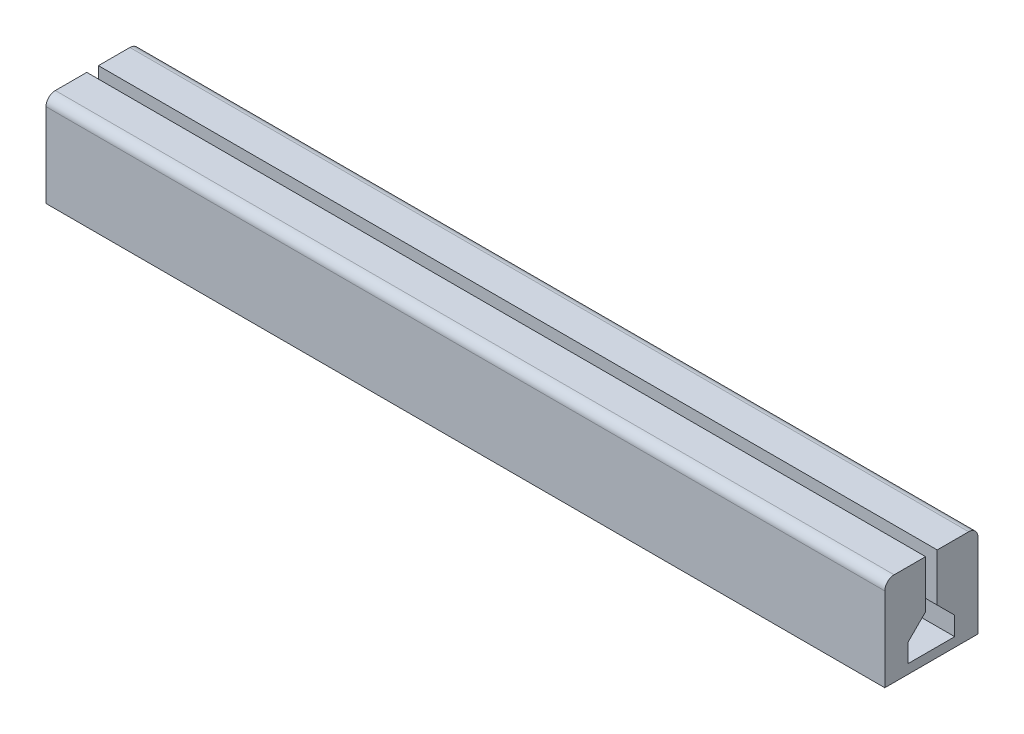
ISO-10303-21;
HEADER;
FILE_DESCRIPTION(('STEP AP214'),'2;1');
FILE_NAME('part.step','',(''),(''),'','','');
FILE_SCHEMA(('AUTOMOTIVE_DESIGN { 1 0 10303 214 1 1 1 1 }'));
ENDSEC;
DATA;
#1=APPLICATION_CONTEXT('core data for automotive mechanical design processes');
#2=APPLICATION_PROTOCOL_DEFINITION('international standard','automotive_design',2000,#1);
#3=PRODUCT_CONTEXT('',#1,'mechanical');
#4=PRODUCT('Part','Part','',(#3));
#5=PRODUCT_RELATED_PRODUCT_CATEGORY('part','',(#4));
#6=PRODUCT_DEFINITION_FORMATION('','',#4);
#7=PRODUCT_DEFINITION_CONTEXT('part definition',#1,'design');
#8=PRODUCT_DEFINITION('design','',#6,#7);
#9=PRODUCT_DEFINITION_SHAPE('','',#8);
#10=(LENGTH_UNIT() NAMED_UNIT(*) SI_UNIT(.MILLI.,.METRE.));
#11=(NAMED_UNIT(*) PLANE_ANGLE_UNIT() SI_UNIT($,.RADIAN.));
#12=(NAMED_UNIT(*) SI_UNIT($,.STERADIAN.) SOLID_ANGLE_UNIT());
#13=UNCERTAINTY_MEASURE_WITH_UNIT(LENGTH_MEASURE(1.E-05),#10,'distance_accuracy_value','');
#14=(GEOMETRIC_REPRESENTATION_CONTEXT(3) GLOBAL_UNCERTAINTY_ASSIGNED_CONTEXT((#13)) GLOBAL_UNIT_ASSIGNED_CONTEXT((#10,
#11,#12)) REPRESENTATION_CONTEXT('',''));
#15=CARTESIAN_POINT('',(0.,0.,0.));
#16=DIRECTION('',(0.,0.,1.));
#17=DIRECTION('',(1.,0.,0.));
#18=AXIS2_PLACEMENT_3D('',#15,#16,#17);
#19=CARTESIAN_POINT('',(114.3,22.86,-10.16));
#20=DIRECTION('',(-1.,0.,0.));
#21=DIRECTION('',(0.,0.,1.));
#22=AXIS2_PLACEMENT_3D('',#19,#20,#21);
#23=CYLINDRICAL_SURFACE('',#22,2.54);
#24=CARTESIAN_POINT('',(-114.3,22.86,-10.16));
#25=DIRECTION('',(1.,0.,0.));
#26=DIRECTION('',(0.,0.,-1.));
#27=AXIS2_PLACEMENT_3D('',#24,#25,#26);
#28=CIRCLE('',#27,2.54);
#29=CARTESIAN_POINT('',(-114.3,25.4,-10.16));
#30=VERTEX_POINT('',#29);
#31=CARTESIAN_POINT('',(-114.3,22.86,-12.7));
#32=VERTEX_POINT('',#31);
#33=EDGE_CURVE('E169',#30,#32,#28,.F.);
#34=ORIENTED_EDGE('',*,*,#33,.F.);
#35=DIRECTION('',(-1.,0.,0.));
#36=VECTOR('',#35,1.);
#37=CARTESIAN_POINT('',(114.3,25.4,-10.16));
#38=LINE('',#37,#36);
#39=CARTESIAN_POINT('',(114.3,25.4,-10.16));
#40=VERTEX_POINT('',#39);
#41=EDGE_CURVE('E11',#40,#30,#38,.T.);
#42=ORIENTED_EDGE('',*,*,#41,.F.);
#43=CARTESIAN_POINT('',(114.3,22.86,-10.16));
#44=DIRECTION('',(1.,0.,0.));
#45=DIRECTION('',(0.,0.,-1.));
#46=AXIS2_PLACEMENT_3D('',#43,#44,#45);
#47=CIRCLE('',#46,2.54);
#48=CARTESIAN_POINT('',(114.3,22.86,-12.7));
#49=VERTEX_POINT('',#48);
#50=EDGE_CURVE('E213',#40,#49,#47,.F.);
#51=ORIENTED_EDGE('',*,*,#50,.T.);
#52=DIRECTION('',(-1.,0.,0.));
#53=VECTOR('',#52,1.);
#54=CARTESIAN_POINT('',(114.3,22.86,-12.7));
#55=LINE('',#54,#53);
#56=EDGE_CURVE('E109',#49,#32,#55,.T.);
#57=ORIENTED_EDGE('',*,*,#56,.T.);
#58=EDGE_LOOP('',(#34,#42,#51,#57));
#59=FACE_BOUND('',#58,.T.);
#60=ADVANCED_FACE('F43',(#59),#23,.T.);
#61=CARTESIAN_POINT('',(114.3,25.4,0.));
#62=DIRECTION('',(0.,-1.,0.));
#63=DIRECTION('',(0.,0.,-1.));
#64=AXIS2_PLACEMENT_3D('',#61,#62,#63);
#65=PLANE('',#64);
#66=DIRECTION('',(0.,0.,1.));
#67=VECTOR('',#66,1.);
#68=CARTESIAN_POINT('',(-114.3,25.4,0.));
#69=LINE('',#68,#67);
#70=CARTESIAN_POINT('',(-114.3,25.4,-1.5875));
#71=VERTEX_POINT('',#70);
#72=EDGE_CURVE('E173',#30,#71,#69,.T.);
#73=ORIENTED_EDGE('',*,*,#72,.T.);
#74=DIRECTION('',(-1.,0.,0.));
#75=VECTOR('',#74,1.);
#76=CARTESIAN_POINT('',(114.3,25.4,-1.5875));
#77=LINE('',#76,#75);
#78=CARTESIAN_POINT('',(114.3,25.4,-1.5875));
#79=VERTEX_POINT('',#78);
#80=EDGE_CURVE('E51',#79,#71,#77,.T.);
#81=ORIENTED_EDGE('',*,*,#80,.F.);
#82=DIRECTION('',(0.,0.,1.));
#83=VECTOR('',#82,1.);
#84=CARTESIAN_POINT('',(114.3,25.4,0.));
#85=LINE('',#84,#83);
#86=EDGE_CURVE('E268',#40,#79,#85,.T.);
#87=ORIENTED_EDGE('',*,*,#86,.F.);
#88=ORIENTED_EDGE('',*,*,#41,.T.);
#89=EDGE_LOOP('',(#73,#81,#87,#88));
#90=FACE_BOUND('',#89,.T.);
#91=ADVANCED_FACE('F300',(#90),#65,.F.);
#92=CARTESIAN_POINT('',(114.3,0.,-1.5875));
#93=DIRECTION('',(0.,0.,-1.));
#94=DIRECTION('',(0.,1.,0.));
#95=AXIS2_PLACEMENT_3D('',#92,#93,#94);
#96=PLANE('',#95);
#97=DIRECTION('',(0.,-1.,0.));
#98=VECTOR('',#97,1.);
#99=CARTESIAN_POINT('',(-114.3,0.,-1.5875));
#100=LINE('',#99,#98);
#101=CARTESIAN_POINT('',(-114.3,12.3824999999999,-1.5875));
#102=VERTEX_POINT('',#101);
#103=EDGE_CURVE('E177',#71,#102,#100,.T.);
#104=ORIENTED_EDGE('',*,*,#103,.T.);
#105=DIRECTION('',(1.,0.,0.));
#106=VECTOR('',#105,1.);
#107=CARTESIAN_POINT('',(-114.3,12.3824999999999,-1.5875));
#108=LINE('',#107,#106);
#109=CARTESIAN_POINT('',(114.3,12.3824999999999,-1.5875));
#110=VERTEX_POINT('',#109);
#111=EDGE_CURVE('E58',#102,#110,#108,.T.);
#112=ORIENTED_EDGE('',*,*,#111,.T.);
#113=DIRECTION('',(0.,-1.,0.));
#114=VECTOR('',#113,1.);
#115=CARTESIAN_POINT('',(114.3,0.,-1.5875));
#116=LINE('',#115,#114);
#117=EDGE_CURVE('E246',#79,#110,#116,.T.);
#118=ORIENTED_EDGE('',*,*,#117,.F.);
#119=ORIENTED_EDGE('',*,*,#80,.T.);
#120=EDGE_LOOP('',(#104,#112,#118,#119));
#121=FACE_BOUND('',#120,.T.);
#122=ADVANCED_FACE('F244',(#121),#96,.F.);
#123=CARTESIAN_POINT('',(114.3,0.,-6.35));
#124=DIRECTION('',(0.,0.,-1.));
#125=DIRECTION('',(0.,1.,0.));
#126=AXIS2_PLACEMENT_3D('',#123,#124,#125);
#127=PLANE('',#126);
#128=DIRECTION('',(0.,-1.,0.));
#129=VECTOR('',#128,1.);
#130=CARTESIAN_POINT('',(-114.3,0.,-6.35));
#131=LINE('',#130,#129);
#132=CARTESIAN_POINT('',(-114.3,7.62,-6.35));
#133=VERTEX_POINT('',#132);
#134=CARTESIAN_POINT('',(-114.3,2.54,-6.35));
#135=VERTEX_POINT('',#134);
#136=EDGE_CURVE('E181',#133,#135,#131,.T.);
#137=ORIENTED_EDGE('',*,*,#136,.T.);
#138=DIRECTION('',(-1.,0.,0.));
#139=VECTOR('',#138,1.);
#140=CARTESIAN_POINT('',(114.3,2.54,-6.35));
#141=LINE('',#140,#139);
#142=CARTESIAN_POINT('',(114.3,2.54,-6.35));
#143=VERTEX_POINT('',#142);
#144=EDGE_CURVE('E232',#143,#135,#141,.T.);
#145=ORIENTED_EDGE('',*,*,#144,.F.);
#146=DIRECTION('',(0.,-1.,0.));
#147=VECTOR('',#146,1.);
#148=CARTESIAN_POINT('',(114.3,0.,-6.35));
#149=LINE('',#148,#147);
#150=CARTESIAN_POINT('',(114.3,7.62,-6.35));
#151=VERTEX_POINT('',#150);
#152=EDGE_CURVE('E273',#151,#143,#149,.T.);
#153=ORIENTED_EDGE('',*,*,#152,.F.);
#154=DIRECTION('',(-1.,0.,0.));
#155=VECTOR('',#154,1.);
#156=CARTESIAN_POINT('',(114.3,7.62,-6.35));
#157=LINE('',#156,#155);
#158=EDGE_CURVE('E235',#151,#133,#157,.T.);
#159=ORIENTED_EDGE('',*,*,#158,.T.);
#160=EDGE_LOOP('',(#137,#145,#153,#159));
#161=FACE_BOUND('',#160,.T.);
#162=ADVANCED_FACE('F306',(#161),#127,.F.);
#163=CARTESIAN_POINT('',(114.3,2.54,0.));
#164=DIRECTION('',(0.,1.,0.));
#165=DIRECTION('',(0.,0.,1.));
#166=AXIS2_PLACEMENT_3D('',#163,#164,#165);
#167=PLANE('',#166);
#168=DIRECTION('',(0.,0.,-1.));
#169=VECTOR('',#168,1.);
#170=CARTESIAN_POINT('',(-114.3,2.54,0.));
#171=LINE('',#170,#169);
#172=CARTESIAN_POINT('',(-114.3,2.54,6.35));
#173=VERTEX_POINT('',#172);
#174=EDGE_CURVE('E185',#173,#135,#171,.T.);
#175=ORIENTED_EDGE('',*,*,#174,.F.);
#176=DIRECTION('',(-1.,0.,0.));
#177=VECTOR('',#176,1.);
#178=CARTESIAN_POINT('',(114.3,2.54,6.35));
#179=LINE('',#178,#177);
#180=CARTESIAN_POINT('',(114.3,2.54,6.35));
#181=VERTEX_POINT('',#180);
#182=EDGE_CURVE('E229',#181,#173,#179,.T.);
#183=ORIENTED_EDGE('',*,*,#182,.F.);
#184=DIRECTION('',(0.,0.,-1.));
#185=VECTOR('',#184,1.);
#186=CARTESIAN_POINT('',(114.3,2.54,0.));
#187=LINE('',#186,#185);
#188=EDGE_CURVE('E276',#181,#143,#187,.T.);
#189=ORIENTED_EDGE('',*,*,#188,.T.);
#190=ORIENTED_EDGE('',*,*,#144,.T.);
#191=EDGE_LOOP('',(#175,#183,#189,#190));
#192=FACE_BOUND('',#191,.T.);
#193=ADVANCED_FACE('F311',(#192),#167,.T.);
#194=CARTESIAN_POINT('',(114.3,0.,6.35));
#195=DIRECTION('',(0.,0.,-1.));
#196=DIRECTION('',(-1.,0.,0.));
#197=AXIS2_PLACEMENT_3D('',#194,#195,#196);
#198=PLANE('',#197);
#199=DIRECTION('',(0.,-1.,0.));
#200=VECTOR('',#199,1.);
#201=CARTESIAN_POINT('',(-114.3,0.,6.35));
#202=LINE('',#201,#200);
#203=CARTESIAN_POINT('',(-114.3,7.62,6.35));
#204=VERTEX_POINT('',#203);
#205=EDGE_CURVE('E189',#204,#173,#202,.T.);
#206=ORIENTED_EDGE('',*,*,#205,.F.);
#207=DIRECTION('',(-1.,0.,0.));
#208=VECTOR('',#207,1.);
#209=CARTESIAN_POINT('',(114.3,7.62,6.35));
#210=LINE('',#209,#208);
#211=CARTESIAN_POINT('',(114.3,7.62,6.35));
#212=VERTEX_POINT('',#211);
#213=EDGE_CURVE('E226',#212,#204,#210,.T.);
#214=ORIENTED_EDGE('',*,*,#213,.F.);
#215=DIRECTION('',(0.,-1.,0.));
#216=VECTOR('',#215,1.);
#217=CARTESIAN_POINT('',(114.3,0.,6.35));
#218=LINE('',#217,#216);
#219=EDGE_CURVE('E280',#212,#181,#218,.T.);
#220=ORIENTED_EDGE('',*,*,#219,.T.);
#221=ORIENTED_EDGE('',*,*,#182,.T.);
#222=EDGE_LOOP('',(#206,#214,#220,#221));
#223=FACE_BOUND('',#222,.T.);
#224=ADVANCED_FACE('F315',(#223),#198,.T.);
#225=CARTESIAN_POINT('',(114.3,0.,1.5875));
#226=DIRECTION('',(0.,0.,-1.));
#227=DIRECTION('',(0.,1.,0.));
#228=AXIS2_PLACEMENT_3D('',#225,#226,#227);
#229=PLANE('',#228);
#230=DIRECTION('',(1.,0.,0.));
#231=VECTOR('',#230,1.);
#232=CARTESIAN_POINT('',(-114.3,12.3824999999999,1.5875));
#233=LINE('',#232,#231);
#234=CARTESIAN_POINT('',(-114.3,12.3824999999999,1.5875));
#235=VERTEX_POINT('',#234);
#236=CARTESIAN_POINT('',(114.3,12.3824999999999,1.5875));
#237=VERTEX_POINT('',#236);
#238=EDGE_CURVE('E174',#235,#237,#233,.T.);
#239=ORIENTED_EDGE('',*,*,#238,.F.);
#240=DIRECTION('',(0.,-1.,0.));
#241=VECTOR('',#240,1.);
#242=CARTESIAN_POINT('',(-114.3,0.,1.5875));
#243=LINE('',#242,#241);
#244=CARTESIAN_POINT('',(-114.3,25.4,1.5875));
#245=VERTEX_POINT('',#244);
#246=EDGE_CURVE('E193',#245,#235,#243,.T.);
#247=ORIENTED_EDGE('',*,*,#246,.F.);
#248=DIRECTION('',(-1.,0.,0.));
#249=VECTOR('',#248,1.);
#250=CARTESIAN_POINT('',(114.3,25.4,1.5875));
#251=LINE('',#250,#249);
#252=CARTESIAN_POINT('',(114.3,25.4,1.5875));
#253=VERTEX_POINT('',#252);
#254=EDGE_CURVE('E223',#253,#245,#251,.T.);
#255=ORIENTED_EDGE('',*,*,#254,.F.);
#256=DIRECTION('',(0.,-1.,0.));
#257=VECTOR('',#256,1.);
#258=CARTESIAN_POINT('',(114.3,0.,1.5875));
#259=LINE('',#258,#257);
#260=EDGE_CURVE('E284',#253,#237,#259,.T.);
#261=ORIENTED_EDGE('',*,*,#260,.T.);
#262=EDGE_LOOP('',(#239,#247,#255,#261));
#263=FACE_BOUND('',#262,.T.);
#264=ADVANCED_FACE('F319',(#263),#229,.T.);
#265=CARTESIAN_POINT('',(114.3,25.4,0.));
#266=DIRECTION('',(0.,1.,0.));
#267=DIRECTION('',(0.,0.,1.));
#268=AXIS2_PLACEMENT_3D('',#265,#266,#267);
#269=PLANE('',#268);
#270=DIRECTION('',(0.,0.,-1.));
#271=VECTOR('',#270,1.);
#272=CARTESIAN_POINT('',(-114.3,25.4,0.));
#273=LINE('',#272,#271);
#274=CARTESIAN_POINT('',(-114.3,25.4,10.16));
#275=VERTEX_POINT('',#274);
#276=EDGE_CURVE('E197',#275,#245,#273,.T.);
#277=ORIENTED_EDGE('',*,*,#276,.F.);
#278=DIRECTION('',(-1.,0.,0.));
#279=VECTOR('',#278,1.);
#280=CARTESIAN_POINT('',(114.3,25.4,10.16));
#281=LINE('',#280,#279);
#282=CARTESIAN_POINT('',(114.3,25.4,10.16));
#283=VERTEX_POINT('',#282);
#284=EDGE_CURVE('E220',#283,#275,#281,.T.);
#285=ORIENTED_EDGE('',*,*,#284,.F.);
#286=DIRECTION('',(0.,0.,-1.));
#287=VECTOR('',#286,1.);
#288=CARTESIAN_POINT('',(114.3,25.4,0.));
#289=LINE('',#288,#287);
#290=EDGE_CURVE('E288',#283,#253,#289,.T.);
#291=ORIENTED_EDGE('',*,*,#290,.T.);
#292=ORIENTED_EDGE('',*,*,#254,.T.);
#293=EDGE_LOOP('',(#277,#285,#291,#292));
#294=FACE_BOUND('',#293,.T.);
#295=ADVANCED_FACE('F323',(#294),#269,.T.);
#296=CARTESIAN_POINT('',(114.3,22.86,10.16));
#297=DIRECTION('',(-1.,0.,0.));
#298=DIRECTION('',(0.,0.,1.));
#299=AXIS2_PLACEMENT_3D('',#296,#297,#298);
#300=CYLINDRICAL_SURFACE('',#299,2.54);
#301=CARTESIAN_POINT('',(-114.3,22.86,10.16));
#302=DIRECTION('',(1.,0.,0.));
#303=DIRECTION('',(0.,0.,-1.));
#304=AXIS2_PLACEMENT_3D('',#301,#302,#303);
#305=CIRCLE('',#304,2.54);
#306=CARTESIAN_POINT('',(-114.3,22.86,12.7));
#307=VERTEX_POINT('',#306);
#308=EDGE_CURVE('E201',#307,#275,#305,.F.);
#309=ORIENTED_EDGE('',*,*,#308,.F.);
#310=DIRECTION('',(-1.,0.,0.));
#311=VECTOR('',#310,1.);
#312=CARTESIAN_POINT('',(114.3,22.86,12.7));
#313=LINE('',#312,#311);
#314=CARTESIAN_POINT('',(114.3,22.86,12.7));
#315=VERTEX_POINT('',#314);
#316=EDGE_CURVE('E150',#315,#307,#313,.T.);
#317=ORIENTED_EDGE('',*,*,#316,.F.);
#318=CARTESIAN_POINT('',(114.3,22.86,10.16));
#319=DIRECTION('',(1.,0.,0.));
#320=DIRECTION('',(0.,0.,-1.));
#321=AXIS2_PLACEMENT_3D('',#318,#319,#320);
#322=CIRCLE('',#321,2.54);
#323=EDGE_CURVE('E159',#315,#283,#322,.F.);
#324=ORIENTED_EDGE('',*,*,#323,.T.);
#325=ORIENTED_EDGE('',*,*,#284,.T.);
#326=EDGE_LOOP('',(#309,#317,#324,#325));
#327=FACE_BOUND('',#326,.T.);
#328=ADVANCED_FACE('F294',(#327),#300,.T.);
#329=CARTESIAN_POINT('',(114.3,0.,12.7));
#330=DIRECTION('',(0.,0.,1.));
#331=DIRECTION('',(1.,0.,0.));
#332=AXIS2_PLACEMENT_3D('',#329,#330,#331);
#333=PLANE('',#332);
#334=DIRECTION('',(0.,1.,0.));
#335=VECTOR('',#334,1.);
#336=CARTESIAN_POINT('',(-114.3,0.,12.7));
#337=LINE('',#336,#335);
#338=CARTESIAN_POINT('',(-114.3,0.,12.7));
#339=VERTEX_POINT('',#338);
#340=EDGE_CURVE('E144',#339,#307,#337,.T.);
#341=ORIENTED_EDGE('',*,*,#340,.F.);
#342=DIRECTION('',(-1.,0.,0.));
#343=VECTOR('',#342,1.);
#344=CARTESIAN_POINT('',(114.3,0.,12.7));
#345=LINE('',#344,#343);
#346=CARTESIAN_POINT('',(114.3,0.,12.7));
#347=VERTEX_POINT('',#346);
#348=EDGE_CURVE('E139',#347,#339,#345,.T.);
#349=ORIENTED_EDGE('',*,*,#348,.F.);
#350=DIRECTION('',(0.,1.,0.));
#351=VECTOR('',#350,1.);
#352=CARTESIAN_POINT('',(114.3,0.,12.7));
#353=LINE('',#352,#351);
#354=EDGE_CURVE('E142',#347,#315,#353,.T.);
#355=ORIENTED_EDGE('',*,*,#354,.T.);
#356=ORIENTED_EDGE('',*,*,#316,.T.);
#357=EDGE_LOOP('',(#341,#349,#355,#356));
#358=FACE_BOUND('',#357,.T.);
#359=ADVANCED_FACE('F141',(#358),#333,.T.);
#360=CARTESIAN_POINT('',(114.3,0.,0.));
#361=DIRECTION('',(0.,-1.,0.));
#362=DIRECTION('',(0.,0.,-1.));
#363=AXIS2_PLACEMENT_3D('',#360,#361,#362);
#364=PLANE('',#363);
#365=DIRECTION('',(0.,0.,1.));
#366=VECTOR('',#365,1.);
#367=CARTESIAN_POINT('',(-114.3,0.,0.));
#368=LINE('',#367,#366);
#369=CARTESIAN_POINT('',(-114.3,0.,-12.7));
#370=VERTEX_POINT('',#369);
#371=EDGE_CURVE('E207',#370,#339,#368,.T.);
#372=ORIENTED_EDGE('',*,*,#371,.F.);
#373=DIRECTION('',(-1.,0.,0.));
#374=VECTOR('',#373,1.);
#375=CARTESIAN_POINT('',(114.3,0.,-12.7));
#376=LINE('',#375,#374);
#377=CARTESIAN_POINT('',(114.3,0.,-12.7));
#378=VERTEX_POINT('',#377);
#379=EDGE_CURVE('E151',#378,#370,#376,.T.);
#380=ORIENTED_EDGE('',*,*,#379,.F.);
#381=DIRECTION('',(0.,0.,1.));
#382=VECTOR('',#381,1.);
#383=CARTESIAN_POINT('',(114.3,0.,0.));
#384=LINE('',#383,#382);
#385=EDGE_CURVE('E156',#378,#347,#384,.T.);
#386=ORIENTED_EDGE('',*,*,#385,.T.);
#387=ORIENTED_EDGE('',*,*,#348,.T.);
#388=EDGE_LOOP('',(#372,#380,#386,#387));
#389=FACE_BOUND('',#388,.T.);
#390=ADVANCED_FACE('F162',(#389),#364,.T.);
#391=CARTESIAN_POINT('',(114.3,0.,-12.7));
#392=DIRECTION('',(0.,0.,1.));
#393=DIRECTION('',(0.,-1.,0.));
#394=AXIS2_PLACEMENT_3D('',#391,#392,#393);
#395=PLANE('',#394);
#396=DIRECTION('',(0.,1.,0.));
#397=VECTOR('',#396,1.);
#398=CARTESIAN_POINT('',(-114.3,0.,-12.7));
#399=LINE('',#398,#397);
#400=EDGE_CURVE('E210',#370,#32,#399,.T.);
#401=ORIENTED_EDGE('',*,*,#400,.T.);
#402=ORIENTED_EDGE('',*,*,#56,.F.);
#403=DIRECTION('',(0.,1.,0.));
#404=VECTOR('',#403,1.);
#405=CARTESIAN_POINT('',(114.3,0.,-12.7));
#406=LINE('',#405,#404);
#407=EDGE_CURVE('E67',#378,#49,#406,.T.);
#408=ORIENTED_EDGE('',*,*,#407,.F.);
#409=ORIENTED_EDGE('',*,*,#379,.T.);
#410=EDGE_LOOP('',(#401,#402,#408,#409));
#411=FACE_BOUND('',#410,.T.);
#412=ADVANCED_FACE('F298',(#411),#395,.F.);
#413=CARTESIAN_POINT('',(114.3,0.,0.));
#414=DIRECTION('',(1.,0.,0.));
#415=DIRECTION('',(0.,0.,-1.));
#416=AXIS2_PLACEMENT_3D('',#413,#414,#415);
#417=PLANE('',#416);
#418=DIRECTION('',(0.,-0.707106781186544,0.707106781186551));
#419=VECTOR('',#418,1.);
#420=CARTESIAN_POINT('',(114.3,7.62,6.35));
#421=LINE('',#420,#419);
#422=EDGE_CURVE('E260',#237,#212,#421,.T.);
#423=ORIENTED_EDGE('',*,*,#422,.F.);
#424=ORIENTED_EDGE('',*,*,#260,.F.);
#425=ORIENTED_EDGE('',*,*,#290,.F.);
#426=ORIENTED_EDGE('',*,*,#323,.F.);
#427=ORIENTED_EDGE('',*,*,#354,.F.);
#428=ORIENTED_EDGE('',*,*,#385,.F.);
#429=ORIENTED_EDGE('',*,*,#407,.T.);
#430=ORIENTED_EDGE('',*,*,#50,.F.);
#431=ORIENTED_EDGE('',*,*,#86,.T.);
#432=ORIENTED_EDGE('',*,*,#117,.T.);
#433=DIRECTION('',(0.,0.707106781186544,0.707106781186551));
#434=VECTOR('',#433,1.);
#435=CARTESIAN_POINT('',(114.3,7.62,-6.35));
#436=LINE('',#435,#434);
#437=EDGE_CURVE('E256',#151,#110,#436,.T.);
#438=ORIENTED_EDGE('',*,*,#437,.F.);
#439=ORIENTED_EDGE('',*,*,#152,.T.);
#440=ORIENTED_EDGE('',*,*,#188,.F.);
#441=ORIENTED_EDGE('',*,*,#219,.F.);
#442=EDGE_LOOP('',(#423,#424,#425,#426,#427,#428,#429,#430,#431,#432,#438,#439,#440,#441));
#443=FACE_BOUND('',#442,.T.);
#444=ADVANCED_FACE('F155',(#443),#417,.T.);
#445=CARTESIAN_POINT('',(-114.3,0.,0.));
#446=DIRECTION('',(1.,0.,0.));
#447=DIRECTION('',(0.,0.,-1.));
#448=AXIS2_PLACEMENT_3D('',#445,#446,#447);
#449=PLANE('',#448);
#450=ORIENTED_EDGE('',*,*,#246,.T.);
#451=DIRECTION('',(0.,-0.707106781186544,0.707106781186551));
#452=VECTOR('',#451,1.);
#453=CARTESIAN_POINT('',(-114.3,7.62,6.35));
#454=LINE('',#453,#452);
#455=EDGE_CURVE('E360',#235,#204,#454,.T.);
#456=ORIENTED_EDGE('',*,*,#455,.T.);
#457=ORIENTED_EDGE('',*,*,#205,.T.);
#458=ORIENTED_EDGE('',*,*,#174,.T.);
#459=ORIENTED_EDGE('',*,*,#136,.F.);
#460=DIRECTION('',(0.,0.707106781186544,0.707106781186551));
#461=VECTOR('',#460,1.);
#462=CARTESIAN_POINT('',(-114.3,7.62,-6.35));
#463=LINE('',#462,#461);
#464=EDGE_CURVE('E252',#133,#102,#463,.T.);
#465=ORIENTED_EDGE('',*,*,#464,.T.);
#466=ORIENTED_EDGE('',*,*,#103,.F.);
#467=ORIENTED_EDGE('',*,*,#72,.F.);
#468=ORIENTED_EDGE('',*,*,#33,.T.);
#469=ORIENTED_EDGE('',*,*,#400,.F.);
#470=ORIENTED_EDGE('',*,*,#371,.T.);
#471=ORIENTED_EDGE('',*,*,#340,.T.);
#472=ORIENTED_EDGE('',*,*,#308,.T.);
#473=ORIENTED_EDGE('',*,*,#276,.T.);
#474=EDGE_LOOP('',(#450,#456,#457,#458,#459,#465,#466,#467,#468,#469,#470,#471,#472,#473));
#475=FACE_BOUND('',#474,.T.);
#476=ADVANCED_FACE('F250',(#475),#449,.F.);
#477=CARTESIAN_POINT('',(-114.3,7.62,-6.35));
#478=DIRECTION('',(0.,0.707106781186551,-0.707106781186544));
#479=DIRECTION('',(0.,0.707106781186544,0.707106781186551));
#480=AXIS2_PLACEMENT_3D('',#477,#478,#479);
#481=PLANE('',#480);
#482=ORIENTED_EDGE('',*,*,#437,.T.);
#483=ORIENTED_EDGE('',*,*,#111,.F.);
#484=ORIENTED_EDGE('',*,*,#464,.F.);
#485=ORIENTED_EDGE('',*,*,#158,.F.);
#486=EDGE_LOOP('',(#482,#483,#484,#485));
#487=FACE_BOUND('',#486,.T.);
#488=ADVANCED_FACE('F338',(#487),#481,.F.);
#489=CARTESIAN_POINT('',(-114.3,7.62,6.35));
#490=DIRECTION('',(0.,0.707106781186551,0.707106781186544));
#491=DIRECTION('',(0.,-0.707106781186544,0.707106781186551));
#492=AXIS2_PLACEMENT_3D('',#489,#490,#491);
#493=PLANE('',#492);
#494=ORIENTED_EDGE('',*,*,#422,.T.);
#495=ORIENTED_EDGE('',*,*,#213,.T.);
#496=ORIENTED_EDGE('',*,*,#455,.F.);
#497=ORIENTED_EDGE('',*,*,#238,.T.);
#498=EDGE_LOOP('',(#494,#495,#496,#497));
#499=FACE_BOUND('',#498,.T.);
#500=ADVANCED_FACE('F343',(#499),#493,.F.);
#501=CLOSED_SHELL('',(#60,#91,#122,#162,#193,#224,#264,#295,#328,#359,#390,#412,#444,#476,#488,#500));
#502=MANIFOLD_SOLID_BREP('B2',#501);
#503=ADVANCED_BREP_SHAPE_REPRESENTATION('',(#18,#502),#14);
#504=SHAPE_DEFINITION_REPRESENTATION(#9,#503);
ENDSEC;
END-ISO-10303-21;
